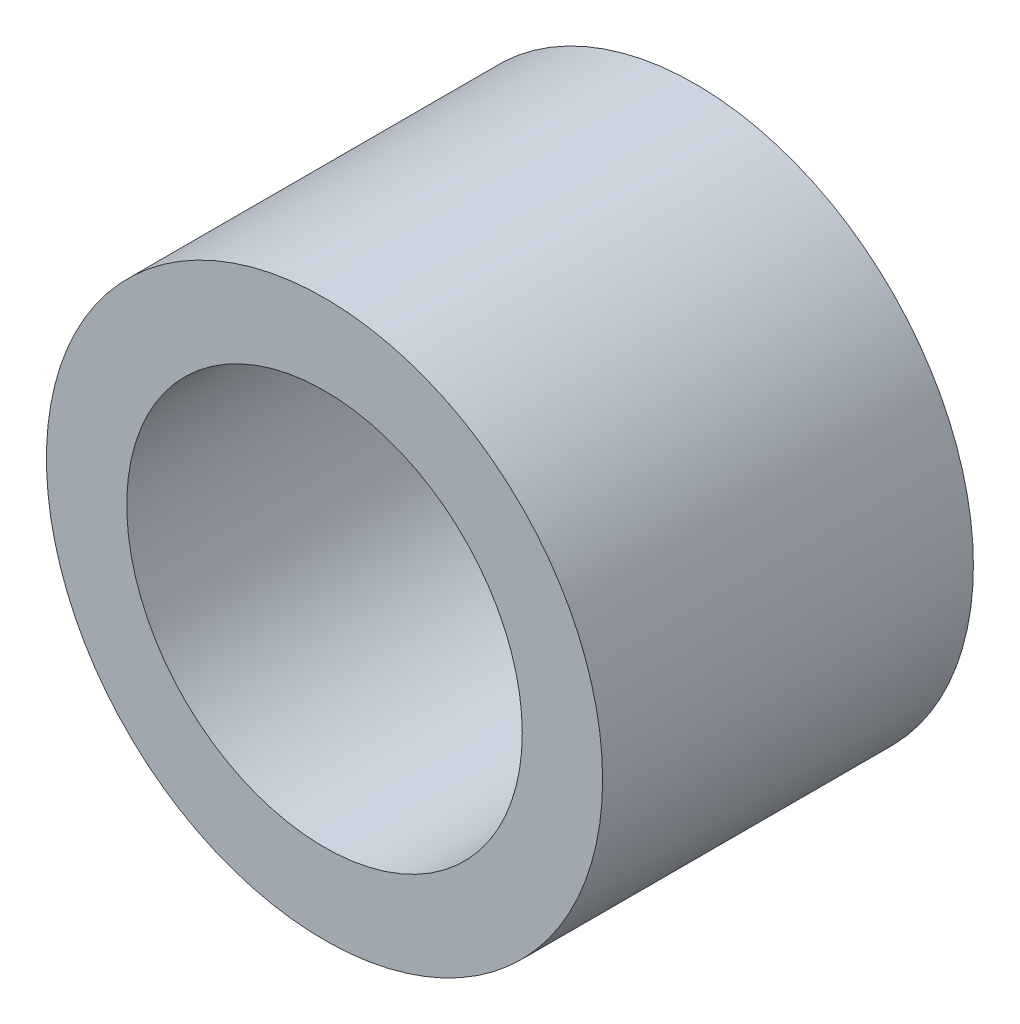
ISO-10303-21;
HEADER;
FILE_DESCRIPTION(('STEP AP214'),'2;1');
FILE_NAME('part.step','',(''),(''),'','','');
FILE_SCHEMA(('AUTOMOTIVE_DESIGN { 1 0 10303 214 1 1 1 1 }'));
ENDSEC;
DATA;
#1=APPLICATION_CONTEXT('core data for automotive mechanical design processes');
#2=APPLICATION_PROTOCOL_DEFINITION('international standard','automotive_design',2000,#1);
#3=PRODUCT_CONTEXT('',#1,'mechanical');
#4=PRODUCT('Part','Part','',(#3));
#5=PRODUCT_RELATED_PRODUCT_CATEGORY('part','',(#4));
#6=PRODUCT_DEFINITION_FORMATION('','',#4);
#7=PRODUCT_DEFINITION_CONTEXT('part definition',#1,'design');
#8=PRODUCT_DEFINITION('design','',#6,#7);
#9=PRODUCT_DEFINITION_SHAPE('','',#8);
#10=(LENGTH_UNIT() NAMED_UNIT(*) SI_UNIT(.MILLI.,.METRE.));
#11=(NAMED_UNIT(*) PLANE_ANGLE_UNIT() SI_UNIT($,.RADIAN.));
#12=(NAMED_UNIT(*) SI_UNIT($,.STERADIAN.) SOLID_ANGLE_UNIT());
#13=UNCERTAINTY_MEASURE_WITH_UNIT(LENGTH_MEASURE(1.E-05),#10,'distance_accuracy_value','');
#14=(GEOMETRIC_REPRESENTATION_CONTEXT(3) GLOBAL_UNCERTAINTY_ASSIGNED_CONTEXT((#13)) GLOBAL_UNIT_ASSIGNED_CONTEXT((#10,
#11,#12)) REPRESENTATION_CONTEXT('',''));
#15=CARTESIAN_POINT('',(0.,0.,0.));
#16=DIRECTION('',(0.,0.,1.));
#17=DIRECTION('',(1.,0.,0.));
#18=AXIS2_PLACEMENT_3D('',#15,#16,#17);
#19=CARTESIAN_POINT('',(0.,0.,1.5));
#20=DIRECTION('',(0.,0.,1.));
#21=DIRECTION('',(1.,0.,0.));
#22=AXIS2_PLACEMENT_3D('',#19,#20,#21);
#23=PLANE('',#22);
#24=CARTESIAN_POINT('',(0.,0.,1.5));
#25=DIRECTION('',(0.,0.,1.));
#26=DIRECTION('',(1.,0.,0.));
#27=AXIS2_PLACEMENT_3D('',#24,#25,#26);
#28=CIRCLE('',#27,2.25);
#29=CARTESIAN_POINT('',(2.25,0.,1.5));
#30=VERTEX_POINT('',#29);
#31=EDGE_CURVE('E10',#30,#30,#28,.T.);
#32=ORIENTED_EDGE('',*,*,#31,.T.);
#33=EDGE_LOOP('',(#32));
#34=FACE_BOUND('',#33,.T.);
#35=CARTESIAN_POINT('',(0.,0.,1.5));
#36=DIRECTION('',(0.,0.,1.));
#37=DIRECTION('',(1.,0.,0.));
#38=AXIS2_PLACEMENT_3D('',#35,#36,#37);
#39=CIRCLE('',#38,1.6);
#40=CARTESIAN_POINT('',(1.6,0.,1.5));
#41=VERTEX_POINT('',#40);
#42=EDGE_CURVE('E45',#41,#41,#39,.T.);
#43=ORIENTED_EDGE('',*,*,#42,.F.);
#44=EDGE_LOOP('',(#43));
#45=FACE_BOUND('',#44,.T.);
#46=ADVANCED_FACE('F34',(#34,#45),#23,.T.);
#47=CARTESIAN_POINT('',(0.,0.,-1.5));
#48=DIRECTION('',(0.,0.,1.));
#49=DIRECTION('',(1.,0.,0.));
#50=AXIS2_PLACEMENT_3D('',#47,#48,#49);
#51=PLANE('',#50);
#52=CARTESIAN_POINT('',(0.,0.,-1.5));
#53=DIRECTION('',(0.,0.,1.));
#54=DIRECTION('',(1.,0.,0.));
#55=AXIS2_PLACEMENT_3D('',#52,#53,#54);
#56=CIRCLE('',#55,2.25);
#57=CARTESIAN_POINT('',(2.25,0.,-1.5));
#58=VERTEX_POINT('',#57);
#59=EDGE_CURVE('E38',#58,#58,#56,.T.);
#60=ORIENTED_EDGE('',*,*,#59,.F.);
#61=EDGE_LOOP('',(#60));
#62=FACE_BOUND('',#61,.T.);
#63=CARTESIAN_POINT('',(0.,0.,-1.5));
#64=DIRECTION('',(0.,0.,1.));
#65=DIRECTION('',(1.,0.,0.));
#66=AXIS2_PLACEMENT_3D('',#63,#64,#65);
#67=CIRCLE('',#66,1.6);
#68=CARTESIAN_POINT('',(1.6,0.,-1.5));
#69=VERTEX_POINT('',#68);
#70=EDGE_CURVE('E47',#69,#69,#67,.T.);
#71=ORIENTED_EDGE('',*,*,#70,.T.);
#72=EDGE_LOOP('',(#71));
#73=FACE_BOUND('',#72,.T.);
#74=ADVANCED_FACE('F57',(#62,#73),#51,.F.);
#75=CARTESIAN_POINT('',(0.,0.,1.5));
#76=DIRECTION('',(0.,0.,-1.));
#77=DIRECTION('',(-1.,0.,0.));
#78=AXIS2_PLACEMENT_3D('',#75,#76,#77);
#79=CYLINDRICAL_SURFACE('',#78,2.25);
#80=ORIENTED_EDGE('',*,*,#31,.F.);
#81=EDGE_LOOP('',(#80));
#82=FACE_BOUND('',#81,.T.);
#83=ORIENTED_EDGE('',*,*,#59,.T.);
#84=EDGE_LOOP('',(#83));
#85=FACE_BOUND('',#84,.T.);
#86=ADVANCED_FACE('F36',(#82,#85),#79,.T.);
#87=CARTESIAN_POINT('',(0.,0.,1.5));
#88=DIRECTION('',(0.,0.,-1.));
#89=DIRECTION('',(-1.,0.,0.));
#90=AXIS2_PLACEMENT_3D('',#87,#88,#89);
#91=CYLINDRICAL_SURFACE('',#90,1.6);
#92=ORIENTED_EDGE('',*,*,#42,.T.);
#93=EDGE_LOOP('',(#92));
#94=FACE_BOUND('',#93,.T.);
#95=ORIENTED_EDGE('',*,*,#70,.F.);
#96=EDGE_LOOP('',(#95));
#97=FACE_BOUND('',#96,.T.);
#98=ADVANCED_FACE('F53',(#94,#97),#91,.F.);
#99=CLOSED_SHELL('',(#46,#74,#86,#98));
#100=MANIFOLD_SOLID_BREP('B2',#99);
#101=ADVANCED_BREP_SHAPE_REPRESENTATION('',(#18,#100),#14);
#102=SHAPE_DEFINITION_REPRESENTATION(#9,#101);
ENDSEC;
END-ISO-10303-21;
